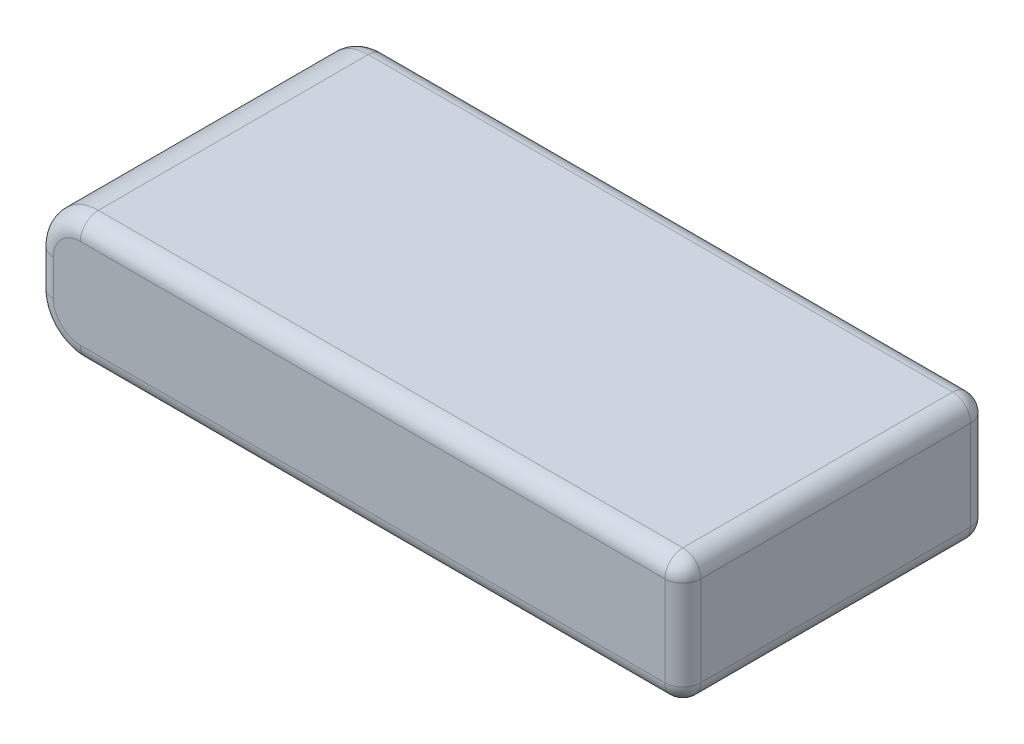
ISO-10303-21;
HEADER;
FILE_DESCRIPTION(('STEP AP214'),'2;1');
FILE_NAME('part.step','',(''),(''),'','','');
FILE_SCHEMA(('AUTOMOTIVE_DESIGN { 1 0 10303 214 1 1 1 1 }'));
ENDSEC;
DATA;
#1=APPLICATION_CONTEXT('core data for automotive mechanical design processes');
#2=APPLICATION_PROTOCOL_DEFINITION('international standard','automotive_design',2000,#1);
#3=PRODUCT_CONTEXT('',#1,'mechanical');
#4=PRODUCT('Part','Part','',(#3));
#5=PRODUCT_RELATED_PRODUCT_CATEGORY('part','',(#4));
#6=PRODUCT_DEFINITION_FORMATION('','',#4);
#7=PRODUCT_DEFINITION_CONTEXT('part definition',#1,'design');
#8=PRODUCT_DEFINITION('design','',#6,#7);
#9=PRODUCT_DEFINITION_SHAPE('','',#8);
#10=(LENGTH_UNIT() NAMED_UNIT(*) SI_UNIT(.MILLI.,.METRE.));
#11=(NAMED_UNIT(*) PLANE_ANGLE_UNIT() SI_UNIT($,.RADIAN.));
#12=(NAMED_UNIT(*) SI_UNIT($,.STERADIAN.) SOLID_ANGLE_UNIT());
#13=UNCERTAINTY_MEASURE_WITH_UNIT(LENGTH_MEASURE(1.E-05),#10,'distance_accuracy_value','');
#14=(GEOMETRIC_REPRESENTATION_CONTEXT(3) GLOBAL_UNCERTAINTY_ASSIGNED_CONTEXT((#13)) GLOBAL_UNIT_ASSIGNED_CONTEXT((#10,
#11,#12)) REPRESENTATION_CONTEXT('',''));
#15=CARTESIAN_POINT('',(0.,0.,0.));
#16=DIRECTION('',(0.,0.,1.));
#17=DIRECTION('',(1.,0.,0.));
#18=AXIS2_PLACEMENT_3D('',#15,#16,#17);
#19=CARTESIAN_POINT('',(36.,14.,17.));
#20=DIRECTION('',(-1.,0.,0.));
#21=DIRECTION('',(0.,0.,1.));
#22=AXIS2_PLACEMENT_3D('',#19,#20,#21);
#23=PLANE('',#22);
#24=DIRECTION('',(0.,0.,-1.));
#25=VECTOR('',#24,1.);
#26=CARTESIAN_POINT('',(36.,12.,17.));
#27=LINE('',#26,#25);
#28=CARTESIAN_POINT('',(36.,12.,-15.));
#29=VERTEX_POINT('',#28);
#30=CARTESIAN_POINT('',(36.,12.,15.));
#31=VERTEX_POINT('',#30);
#32=EDGE_CURVE('E247',#29,#31,#27,.F.);
#33=ORIENTED_EDGE('',*,*,#32,.T.);
#34=DIRECTION('',(0.,-1.,0.));
#35=VECTOR('',#34,1.);
#36=CARTESIAN_POINT('',(36.,14.,15.));
#37=LINE('',#36,#35);
#38=CARTESIAN_POINT('',(36.,2.,15.));
#39=VERTEX_POINT('',#38);
#40=EDGE_CURVE('E250',#31,#39,#37,.T.);
#41=ORIENTED_EDGE('',*,*,#40,.T.);
#42=DIRECTION('',(0.,0.,-1.));
#43=VECTOR('',#42,1.);
#44=CARTESIAN_POINT('',(36.,2.,-17.));
#45=LINE('',#44,#43);
#46=CARTESIAN_POINT('',(36.,2.,-15.));
#47=VERTEX_POINT('',#46);
#48=EDGE_CURVE('E242',#39,#47,#45,.T.);
#49=ORIENTED_EDGE('',*,*,#48,.T.);
#50=DIRECTION('',(0.,-1.,0.));
#51=VECTOR('',#50,1.);
#52=CARTESIAN_POINT('',(36.,14.,-15.));
#53=LINE('',#52,#51);
#54=EDGE_CURVE('E166',#47,#29,#53,.F.);
#55=ORIENTED_EDGE('',*,*,#54,.T.);
#56=EDGE_LOOP('',(#33,#41,#49,#55));
#57=FACE_BOUND('',#56,.T.);
#58=ADVANCED_FACE('F47',(#57),#23,.F.);
#59=CARTESIAN_POINT('',(-36.,14.,-17.));
#60=DIRECTION('',(0.,0.,1.));
#61=DIRECTION('',(1.,0.,0.));
#62=AXIS2_PLACEMENT_3D('',#59,#60,#61);
#63=PLANE('',#62);
#64=CARTESIAN_POINT('',(-31.,9.,-17.));
#65=DIRECTION('',(0.,0.,1.));
#66=DIRECTION('',(1.,0.,0.));
#67=AXIS2_PLACEMENT_3D('',#64,#65,#66);
#68=CIRCLE('',#67,3.);
#69=CARTESIAN_POINT('',(-34.,9.,-17.));
#70=VERTEX_POINT('',#69);
#71=CARTESIAN_POINT('',(-31.,12.,-17.));
#72=VERTEX_POINT('',#71);
#73=EDGE_CURVE('E199',#70,#72,#68,.F.);
#74=ORIENTED_EDGE('',*,*,#73,.T.);
#75=DIRECTION('',(-1.,0.,0.));
#76=VECTOR('',#75,1.);
#77=CARTESIAN_POINT('',(-36.,12.,-17.));
#78=LINE('',#77,#76);
#79=CARTESIAN_POINT('',(34.,12.,-17.));
#80=VERTEX_POINT('',#79);
#81=EDGE_CURVE('E154',#72,#80,#78,.F.);
#82=ORIENTED_EDGE('',*,*,#81,.T.);
#83=DIRECTION('',(0.,-1.,0.));
#84=VECTOR('',#83,1.);
#85=CARTESIAN_POINT('',(34.,14.,-17.));
#86=LINE('',#85,#84);
#87=CARTESIAN_POINT('',(34.,2.,-17.));
#88=VERTEX_POINT('',#87);
#89=EDGE_CURVE('E146',#80,#88,#86,.T.);
#90=ORIENTED_EDGE('',*,*,#89,.T.);
#91=DIRECTION('',(-1.,0.,0.));
#92=VECTOR('',#91,1.);
#93=CARTESIAN_POINT('',(-31.,2.,-17.));
#94=LINE('',#93,#92);
#95=CARTESIAN_POINT('',(-31.,2.,-17.));
#96=VERTEX_POINT('',#95);
#97=EDGE_CURVE('E151',#88,#96,#94,.T.);
#98=ORIENTED_EDGE('',*,*,#97,.T.);
#99=CARTESIAN_POINT('',(-31.,5.,-17.));
#100=DIRECTION('',(0.,0.,1.));
#101=DIRECTION('',(1.,0.,0.));
#102=AXIS2_PLACEMENT_3D('',#99,#100,#101);
#103=CIRCLE('',#102,3.);
#104=CARTESIAN_POINT('',(-34.,5.,-17.));
#105=VERTEX_POINT('',#104);
#106=EDGE_CURVE('E159',#96,#105,#103,.F.);
#107=ORIENTED_EDGE('',*,*,#106,.T.);
#108=DIRECTION('',(0.,-1.,0.));
#109=VECTOR('',#108,1.);
#110=CARTESIAN_POINT('',(-34.,14.,-17.));
#111=LINE('',#110,#109);
#112=EDGE_CURVE('E196',#105,#70,#111,.F.);
#113=ORIENTED_EDGE('',*,*,#112,.T.);
#114=EDGE_LOOP('',(#74,#82,#90,#98,#107,#113));
#115=FACE_BOUND('',#114,.T.);
#116=ADVANCED_FACE('F149',(#115),#63,.F.);
#117=CARTESIAN_POINT('',(-36.,14.,17.));
#118=DIRECTION('',(1.,0.,0.));
#119=DIRECTION('',(0.,0.,-1.));
#120=AXIS2_PLACEMENT_3D('',#117,#118,#119);
#121=PLANE('',#120);
#122=DIRECTION('',(0.,0.,1.));
#123=VECTOR('',#122,1.);
#124=CARTESIAN_POINT('',(-36.,9.,17.));
#125=LINE('',#124,#123);
#126=CARTESIAN_POINT('',(-36.,9.,15.));
#127=VERTEX_POINT('',#126);
#128=CARTESIAN_POINT('',(-36.,9.,-15.));
#129=VERTEX_POINT('',#128);
#130=EDGE_CURVE('E331',#127,#129,#125,.F.);
#131=ORIENTED_EDGE('',*,*,#130,.T.);
#132=DIRECTION('',(0.,-1.,0.));
#133=VECTOR('',#132,1.);
#134=CARTESIAN_POINT('',(-36.,14.,-15.));
#135=LINE('',#134,#133);
#136=CARTESIAN_POINT('',(-36.,5.,-15.));
#137=VERTEX_POINT('',#136);
#138=EDGE_CURVE('E214',#129,#137,#135,.T.);
#139=ORIENTED_EDGE('',*,*,#138,.T.);
#140=DIRECTION('',(0.,0.,1.));
#141=VECTOR('',#140,1.);
#142=CARTESIAN_POINT('',(-36.,5.,17.));
#143=LINE('',#142,#141);
#144=CARTESIAN_POINT('',(-36.,5.,15.));
#145=VERTEX_POINT('',#144);
#146=EDGE_CURVE('E336',#137,#145,#143,.T.);
#147=ORIENTED_EDGE('',*,*,#146,.T.);
#148=DIRECTION('',(0.,-1.,0.));
#149=VECTOR('',#148,1.);
#150=CARTESIAN_POINT('',(-36.,14.,15.));
#151=LINE('',#150,#149);
#152=EDGE_CURVE('E211',#145,#127,#151,.F.);
#153=ORIENTED_EDGE('',*,*,#152,.T.);
#154=EDGE_LOOP('',(#131,#139,#147,#153));
#155=FACE_BOUND('',#154,.T.);
#156=ADVANCED_FACE('F401',(#155),#121,.F.);
#157=CARTESIAN_POINT('',(-36.,14.,17.));
#158=DIRECTION('',(0.,0.,-1.));
#159=DIRECTION('',(-1.,0.,0.));
#160=AXIS2_PLACEMENT_3D('',#157,#158,#159);
#161=PLANE('',#160);
#162=CARTESIAN_POINT('',(-31.,5.,17.));
#163=DIRECTION('',(0.,0.,-1.));
#164=DIRECTION('',(-1.,0.,0.));
#165=AXIS2_PLACEMENT_3D('',#162,#163,#164);
#166=CIRCLE('',#165,3.);
#167=CARTESIAN_POINT('',(-34.,5.,17.));
#168=VERTEX_POINT('',#167);
#169=CARTESIAN_POINT('',(-31.,2.,17.));
#170=VERTEX_POINT('',#169);
#171=EDGE_CURVE('E235',#168,#170,#166,.F.);
#172=ORIENTED_EDGE('',*,*,#171,.T.);
#173=DIRECTION('',(1.,0.,0.));
#174=VECTOR('',#173,1.);
#175=CARTESIAN_POINT('',(36.,2.,17.));
#176=LINE('',#175,#174);
#177=CARTESIAN_POINT('',(34.,2.,17.));
#178=VERTEX_POINT('',#177);
#179=EDGE_CURVE('E239',#170,#178,#176,.T.);
#180=ORIENTED_EDGE('',*,*,#179,.T.);
#181=DIRECTION('',(0.,-1.,0.));
#182=VECTOR('',#181,1.);
#183=CARTESIAN_POINT('',(34.,14.,17.));
#184=LINE('',#183,#182);
#185=CARTESIAN_POINT('',(34.,12.,17.));
#186=VERTEX_POINT('',#185);
#187=EDGE_CURVE('E226',#178,#186,#184,.F.);
#188=ORIENTED_EDGE('',*,*,#187,.T.);
#189=DIRECTION('',(1.,0.,0.));
#190=VECTOR('',#189,1.);
#191=CARTESIAN_POINT('',(-36.,12.,17.));
#192=LINE('',#191,#190);
#193=CARTESIAN_POINT('',(-31.,12.,17.));
#194=VERTEX_POINT('',#193);
#195=EDGE_CURVE('E223',#186,#194,#192,.F.);
#196=ORIENTED_EDGE('',*,*,#195,.T.);
#197=CARTESIAN_POINT('',(-31.,9.,17.));
#198=DIRECTION('',(0.,0.,-1.));
#199=DIRECTION('',(-1.,0.,0.));
#200=AXIS2_PLACEMENT_3D('',#197,#198,#199);
#201=CIRCLE('',#200,3.);
#202=CARTESIAN_POINT('',(-34.,9.,17.));
#203=VERTEX_POINT('',#202);
#204=EDGE_CURVE('E229',#194,#203,#201,.F.);
#205=ORIENTED_EDGE('',*,*,#204,.T.);
#206=DIRECTION('',(0.,-1.,0.));
#207=VECTOR('',#206,1.);
#208=CARTESIAN_POINT('',(-34.,14.,17.));
#209=LINE('',#208,#207);
#210=EDGE_CURVE('E232',#203,#168,#209,.T.);
#211=ORIENTED_EDGE('',*,*,#210,.T.);
#212=EDGE_LOOP('',(#172,#180,#188,#196,#205,#211));
#213=FACE_BOUND('',#212,.T.);
#214=ADVANCED_FACE('F391',(#213),#161,.F.);
#215=CARTESIAN_POINT('',(0.,14.,0.));
#216=DIRECTION('',(0.,-1.,0.));
#217=DIRECTION('',(0.,0.,-1.));
#218=AXIS2_PLACEMENT_3D('',#215,#216,#217);
#219=PLANE('',#218);
#220=DIRECTION('',(0.,0.,-1.));
#221=VECTOR('',#220,1.);
#222=CARTESIAN_POINT('',(34.,14.,0.));
#223=LINE('',#222,#221);
#224=CARTESIAN_POINT('',(34.,14.,15.));
#225=VERTEX_POINT('',#224);
#226=CARTESIAN_POINT('',(34.,14.,-15.));
#227=VERTEX_POINT('',#226);
#228=EDGE_CURVE('E257',#225,#227,#223,.T.);
#229=ORIENTED_EDGE('',*,*,#228,.T.);
#230=DIRECTION('',(-1.,0.,0.));
#231=VECTOR('',#230,1.);
#232=CARTESIAN_POINT('',(0.,14.,-15.));
#233=LINE('',#232,#231);
#234=CARTESIAN_POINT('',(-31.,14.,-15.));
#235=VERTEX_POINT('',#234);
#236=EDGE_CURVE('E260',#227,#235,#233,.T.);
#237=ORIENTED_EDGE('',*,*,#236,.T.);
#238=DIRECTION('',(0.,0.,1.));
#239=VECTOR('',#238,1.);
#240=CARTESIAN_POINT('',(-31.,14.,0.));
#241=LINE('',#240,#239);
#242=CARTESIAN_POINT('',(-31.,14.,15.));
#243=VERTEX_POINT('',#242);
#244=EDGE_CURVE('E186',#235,#243,#241,.T.);
#245=ORIENTED_EDGE('',*,*,#244,.T.);
#246=DIRECTION('',(1.,0.,0.));
#247=VECTOR('',#246,1.);
#248=CARTESIAN_POINT('',(0.,14.,15.));
#249=LINE('',#248,#247);
#250=EDGE_CURVE('E254',#243,#225,#249,.T.);
#251=ORIENTED_EDGE('',*,*,#250,.T.);
#252=EDGE_LOOP('',(#229,#237,#245,#251));
#253=FACE_BOUND('',#252,.T.);
#254=ADVANCED_FACE('F406',(#253),#219,.F.);
#255=CARTESIAN_POINT('',(0.,0.,0.));
#256=DIRECTION('',(0.,-1.,0.));
#257=DIRECTION('',(0.,0.,-1.));
#258=AXIS2_PLACEMENT_3D('',#255,#256,#257);
#259=PLANE('',#258);
#260=DIRECTION('',(0.,0.,1.));
#261=VECTOR('',#260,1.);
#262=CARTESIAN_POINT('',(-31.,0.,-17.));
#263=LINE('',#262,#261);
#264=CARTESIAN_POINT('',(-31.,0.,15.));
#265=VERTEX_POINT('',#264);
#266=CARTESIAN_POINT('',(-31.,0.,-15.));
#267=VERTEX_POINT('',#266);
#268=EDGE_CURVE('E190',#265,#267,#263,.F.);
#269=ORIENTED_EDGE('',*,*,#268,.T.);
#270=DIRECTION('',(-1.,0.,0.));
#271=VECTOR('',#270,1.);
#272=CARTESIAN_POINT('',(36.,0.,-15.));
#273=LINE('',#272,#271);
#274=CARTESIAN_POINT('',(34.,0.,-15.));
#275=VERTEX_POINT('',#274);
#276=EDGE_CURVE('E11',#267,#275,#273,.F.);
#277=ORIENTED_EDGE('',*,*,#276,.T.);
#278=DIRECTION('',(0.,0.,-1.));
#279=VECTOR('',#278,1.);
#280=CARTESIAN_POINT('',(34.,0.,17.));
#281=LINE('',#280,#279);
#282=CARTESIAN_POINT('',(34.,0.,15.));
#283=VERTEX_POINT('',#282);
#284=EDGE_CURVE('E57',#275,#283,#281,.F.);
#285=ORIENTED_EDGE('',*,*,#284,.T.);
#286=DIRECTION('',(1.,0.,0.));
#287=VECTOR('',#286,1.);
#288=CARTESIAN_POINT('',(-31.,0.,15.));
#289=LINE('',#288,#287);
#290=EDGE_CURVE('E263',#283,#265,#289,.F.);
#291=ORIENTED_EDGE('',*,*,#290,.T.);
#292=EDGE_LOOP('',(#269,#277,#285,#291));
#293=FACE_BOUND('',#292,.T.);
#294=ADVANCED_FACE('F345',(#293),#259,.T.);
#295=CARTESIAN_POINT('',(-31.,5.,17.));
#296=DIRECTION('',(0.,0.,-1.));
#297=DIRECTION('',(-1.,0.,0.));
#298=AXIS2_PLACEMENT_3D('',#295,#296,#297);
#299=CYLINDRICAL_SURFACE('',#298,5.);
#300=ORIENTED_EDGE('',*,*,#146,.F.);
#301=CARTESIAN_POINT('',(-31.,5.,-15.));
#302=DIRECTION('',(0.,0.,1.));
#303=DIRECTION('',(1.,0.,0.));
#304=AXIS2_PLACEMENT_3D('',#301,#302,#303);
#305=CIRCLE('',#304,5.);
#306=EDGE_CURVE('E220',#137,#267,#305,.T.);
#307=ORIENTED_EDGE('',*,*,#306,.T.);
#308=ORIENTED_EDGE('',*,*,#268,.F.);
#309=CARTESIAN_POINT('',(-31.,5.,15.));
#310=DIRECTION('',(0.,0.,-1.));
#311=DIRECTION('',(-1.,0.,0.));
#312=AXIS2_PLACEMENT_3D('',#309,#310,#311);
#313=CIRCLE('',#312,5.);
#314=EDGE_CURVE('E217',#265,#145,#313,.T.);
#315=ORIENTED_EDGE('',*,*,#314,.T.);
#316=EDGE_LOOP('',(#300,#307,#308,#315));
#317=FACE_BOUND('',#316,.T.);
#318=ADVANCED_FACE('F400',(#317),#299,.T.);
#319=CARTESIAN_POINT('',(-31.,9.,0.));
#320=DIRECTION('',(0.,0.,1.));
#321=DIRECTION('',(1.,0.,0.));
#322=AXIS2_PLACEMENT_3D('',#319,#320,#321);
#323=CYLINDRICAL_SURFACE('',#322,5.);
#324=ORIENTED_EDGE('',*,*,#244,.F.);
#325=CARTESIAN_POINT('',(-31.,9.,-15.));
#326=DIRECTION('',(0.,0.,1.));
#327=DIRECTION('',(1.,0.,0.));
#328=AXIS2_PLACEMENT_3D('',#325,#326,#327);
#329=CIRCLE('',#328,5.);
#330=EDGE_CURVE('E207',#235,#129,#329,.T.);
#331=ORIENTED_EDGE('',*,*,#330,.T.);
#332=ORIENTED_EDGE('',*,*,#130,.F.);
#333=CARTESIAN_POINT('',(-31.,9.,15.));
#334=DIRECTION('',(0.,0.,-1.));
#335=DIRECTION('',(-1.,0.,0.));
#336=AXIS2_PLACEMENT_3D('',#333,#334,#335);
#337=CIRCLE('',#336,5.);
#338=EDGE_CURVE('E204',#127,#243,#337,.T.);
#339=ORIENTED_EDGE('',*,*,#338,.T.);
#340=EDGE_LOOP('',(#324,#331,#332,#339));
#341=FACE_BOUND('',#340,.T.);
#342=ADVANCED_FACE('F404',(#341),#323,.T.);
#343=CARTESIAN_POINT('',(-31.,5.,15.));
#344=DIRECTION('',(0.,0.,-1.));
#345=DIRECTION('',(-1.,0.,0.));
#346=AXIS2_PLACEMENT_3D('',#343,#344,#345);
#347=TOROIDAL_SURFACE('',#346,3.,2.);
#348=CARTESIAN_POINT('',(-34.,5.,15.));
#349=DIRECTION('',(0.,1.,0.));
#350=DIRECTION('',(0.,0.,1.));
#351=AXIS2_PLACEMENT_3D('',#348,#349,#350);
#352=CIRCLE('',#351,2.);
#353=EDGE_CURVE('E322',#145,#168,#352,.T.);
#354=ORIENTED_EDGE('',*,*,#353,.F.);
#355=ORIENTED_EDGE('',*,*,#314,.F.);
#356=CARTESIAN_POINT('',(-31.,2.,15.));
#357=DIRECTION('',(1.,0.,0.));
#358=DIRECTION('',(0.,0.,-1.));
#359=AXIS2_PLACEMENT_3D('',#356,#357,#358);
#360=CIRCLE('',#359,2.);
#361=EDGE_CURVE('E51',#170,#265,#360,.T.);
#362=ORIENTED_EDGE('',*,*,#361,.F.);
#363=ORIENTED_EDGE('',*,*,#171,.F.);
#364=EDGE_LOOP('',(#354,#355,#362,#363));
#365=FACE_BOUND('',#364,.T.);
#366=ADVANCED_FACE('F49',(#365),#347,.T.);
#367=CARTESIAN_POINT('',(-36.,2.,15.));
#368=DIRECTION('',(-1.,0.,0.));
#369=DIRECTION('',(0.,0.,1.));
#370=AXIS2_PLACEMENT_3D('',#367,#368,#369);
#371=CYLINDRICAL_SURFACE('',#370,2.);
#372=ORIENTED_EDGE('',*,*,#361,.T.);
#373=ORIENTED_EDGE('',*,*,#290,.F.);
#374=CARTESIAN_POINT('',(34.,2.,15.));
#375=DIRECTION('',(1.,0.,0.));
#376=DIRECTION('',(0.,0.,-1.));
#377=AXIS2_PLACEMENT_3D('',#374,#375,#376);
#378=CIRCLE('',#377,2.);
#379=EDGE_CURVE('E319',#178,#283,#378,.T.);
#380=ORIENTED_EDGE('',*,*,#379,.F.);
#381=ORIENTED_EDGE('',*,*,#179,.F.);
#382=EDGE_LOOP('',(#372,#373,#380,#381));
#383=FACE_BOUND('',#382,.T.);
#384=ADVANCED_FACE('F462',(#383),#371,.T.);
#385=CARTESIAN_POINT('',(-34.,14.,15.));
#386=DIRECTION('',(0.,-1.,0.));
#387=DIRECTION('',(0.,0.,-1.));
#388=AXIS2_PLACEMENT_3D('',#385,#386,#387);
#389=CYLINDRICAL_SURFACE('',#388,2.);
#390=ORIENTED_EDGE('',*,*,#353,.T.);
#391=ORIENTED_EDGE('',*,*,#210,.F.);
#392=CARTESIAN_POINT('',(-34.,9.,15.));
#393=DIRECTION('',(0.,1.,0.));
#394=DIRECTION('',(0.,0.,1.));
#395=AXIS2_PLACEMENT_3D('',#392,#393,#394);
#396=CIRCLE('',#395,2.);
#397=EDGE_CURVE('E315',#127,#203,#396,.T.);
#398=ORIENTED_EDGE('',*,*,#397,.F.);
#399=ORIENTED_EDGE('',*,*,#152,.F.);
#400=EDGE_LOOP('',(#390,#391,#398,#399));
#401=FACE_BOUND('',#400,.T.);
#402=ADVANCED_FACE('F396',(#401),#389,.T.);
#403=CARTESIAN_POINT('',(34.,2.,15.));
#404=DIRECTION('',(0.,-1.,0.));
#405=DIRECTION('',(0.,0.,-1.));
#406=AXIS2_PLACEMENT_3D('',#403,#404,#405);
#407=SPHERICAL_SURFACE('',#406,2.);
#408=CARTESIAN_POINT('',(34.,2.,15.));
#409=DIRECTION('',(0.,-1.,0.));
#410=DIRECTION('',(0.,0.,-1.));
#411=AXIS2_PLACEMENT_3D('',#408,#409,#410);
#412=CIRCLE('',#411,2.);
#413=EDGE_CURVE('E307',#178,#39,#412,.F.);
#414=ORIENTED_EDGE('',*,*,#413,.F.);
#415=ORIENTED_EDGE('',*,*,#379,.T.);
#416=CARTESIAN_POINT('',(34.,2.,15.));
#417=DIRECTION('',(0.,0.,1.));
#418=DIRECTION('',(1.,0.,0.));
#419=AXIS2_PLACEMENT_3D('',#416,#417,#418);
#420=CIRCLE('',#419,2.);
#421=EDGE_CURVE('E311',#39,#283,#420,.F.);
#422=ORIENTED_EDGE('',*,*,#421,.F.);
#423=EDGE_LOOP('',(#414,#415,#422));
#424=FACE_BOUND('',#423,.T.);
#425=ADVANCED_FACE('F457',(#424),#407,.T.);
#426=CARTESIAN_POINT('',(-31.,9.,15.));
#427=DIRECTION('',(0.,0.,-1.));
#428=DIRECTION('',(-1.,0.,0.));
#429=AXIS2_PLACEMENT_3D('',#426,#427,#428);
#430=TOROIDAL_SURFACE('',#429,3.,2.);
#431=ORIENTED_EDGE('',*,*,#397,.T.);
#432=ORIENTED_EDGE('',*,*,#204,.F.);
#433=CARTESIAN_POINT('',(-31.,12.,15.));
#434=DIRECTION('',(1.,0.,0.));
#435=DIRECTION('',(0.,0.,-1.));
#436=AXIS2_PLACEMENT_3D('',#433,#434,#435);
#437=CIRCLE('',#436,2.);
#438=EDGE_CURVE('E303',#243,#194,#437,.T.);
#439=ORIENTED_EDGE('',*,*,#438,.F.);
#440=ORIENTED_EDGE('',*,*,#338,.F.);
#441=EDGE_LOOP('',(#431,#432,#439,#440));
#442=FACE_BOUND('',#441,.T.);
#443=ADVANCED_FACE('F393',(#442),#430,.T.);
#444=CARTESIAN_POINT('',(34.,2.,17.));
#445=DIRECTION('',(0.,0.,1.));
#446=DIRECTION('',(1.,0.,0.));
#447=AXIS2_PLACEMENT_3D('',#444,#445,#446);
#448=CYLINDRICAL_SURFACE('',#447,2.);
#449=ORIENTED_EDGE('',*,*,#421,.T.);
#450=ORIENTED_EDGE('',*,*,#284,.F.);
#451=CARTESIAN_POINT('',(34.,2.,-15.));
#452=DIRECTION('',(0.,0.,-1.));
#453=DIRECTION('',(-1.,0.,0.));
#454=AXIS2_PLACEMENT_3D('',#451,#452,#453);
#455=CIRCLE('',#454,2.);
#456=EDGE_CURVE('E176',#47,#275,#455,.T.);
#457=ORIENTED_EDGE('',*,*,#456,.F.);
#458=ORIENTED_EDGE('',*,*,#48,.F.);
#459=EDGE_LOOP('',(#449,#450,#457,#458));
#460=FACE_BOUND('',#459,.T.);
#461=ADVANCED_FACE('F451',(#460),#448,.T.);
#462=CARTESIAN_POINT('',(34.,14.,15.));
#463=DIRECTION('',(0.,-1.,0.));
#464=DIRECTION('',(0.,0.,-1.));
#465=AXIS2_PLACEMENT_3D('',#462,#463,#464);
#466=CYLINDRICAL_SURFACE('',#465,2.);
#467=ORIENTED_EDGE('',*,*,#413,.T.);
#468=ORIENTED_EDGE('',*,*,#40,.F.);
#469=CARTESIAN_POINT('',(34.,12.,15.));
#470=DIRECTION('',(0.,1.,0.));
#471=DIRECTION('',(0.,0.,1.));
#472=AXIS2_PLACEMENT_3D('',#469,#470,#471);
#473=CIRCLE('',#472,2.);
#474=EDGE_CURVE('E297',#186,#31,#473,.T.);
#475=ORIENTED_EDGE('',*,*,#474,.F.);
#476=ORIENTED_EDGE('',*,*,#187,.F.);
#477=EDGE_LOOP('',(#467,#468,#475,#476));
#478=FACE_BOUND('',#477,.T.);
#479=ADVANCED_FACE('F378',(#478),#466,.T.);
#480=CARTESIAN_POINT('',(0.,12.,15.));
#481=DIRECTION('',(1.,0.,0.));
#482=DIRECTION('',(0.,0.,-1.));
#483=AXIS2_PLACEMENT_3D('',#480,#481,#482);
#484=CYLINDRICAL_SURFACE('',#483,2.);
#485=ORIENTED_EDGE('',*,*,#438,.T.);
#486=ORIENTED_EDGE('',*,*,#195,.F.);
#487=CARTESIAN_POINT('',(34.,12.,15.));
#488=DIRECTION('',(1.,0.,0.));
#489=DIRECTION('',(0.,0.,-1.));
#490=AXIS2_PLACEMENT_3D('',#487,#488,#489);
#491=CIRCLE('',#490,2.);
#492=EDGE_CURVE('E179',#225,#186,#491,.T.);
#493=ORIENTED_EDGE('',*,*,#492,.F.);
#494=ORIENTED_EDGE('',*,*,#250,.F.);
#495=EDGE_LOOP('',(#485,#486,#493,#494));
#496=FACE_BOUND('',#495,.T.);
#497=ADVANCED_FACE('F387',(#496),#484,.T.);
#498=CARTESIAN_POINT('',(34.,2.,-15.));
#499=DIRECTION('',(0.,-1.,0.));
#500=DIRECTION('',(0.,0.,-1.));
#501=AXIS2_PLACEMENT_3D('',#498,#499,#500);
#502=SPHERICAL_SURFACE('',#501,2.);
#503=CARTESIAN_POINT('',(34.,2.,-15.));
#504=DIRECTION('',(0.,-1.,0.));
#505=DIRECTION('',(0.,0.,-1.));
#506=AXIS2_PLACEMENT_3D('',#503,#504,#505);
#507=CIRCLE('',#506,2.);
#508=EDGE_CURVE('E163',#47,#88,#507,.F.);
#509=ORIENTED_EDGE('',*,*,#508,.F.);
#510=ORIENTED_EDGE('',*,*,#456,.T.);
#511=CARTESIAN_POINT('',(34.,2.,-15.));
#512=DIRECTION('',(1.,0.,0.));
#513=DIRECTION('',(0.,0.,-1.));
#514=AXIS2_PLACEMENT_3D('',#511,#512,#513);
#515=CIRCLE('',#514,2.);
#516=EDGE_CURVE('E170',#88,#275,#515,.F.);
#517=ORIENTED_EDGE('',*,*,#516,.F.);
#518=EDGE_LOOP('',(#509,#510,#517));
#519=FACE_BOUND('',#518,.T.);
#520=ADVANCED_FACE('F174',(#519),#502,.T.);
#521=CARTESIAN_POINT('',(34.,12.,15.));
#522=DIRECTION('',(0.,0.,1.));
#523=DIRECTION('',(1.,0.,0.));
#524=AXIS2_PLACEMENT_3D('',#521,#522,#523);
#525=SPHERICAL_SURFACE('',#524,2.);
#526=ORIENTED_EDGE('',*,*,#492,.T.);
#527=ORIENTED_EDGE('',*,*,#474,.T.);
#528=CARTESIAN_POINT('',(34.,12.,15.));
#529=DIRECTION('',(0.,0.,1.));
#530=DIRECTION('',(1.,0.,0.));
#531=AXIS2_PLACEMENT_3D('',#528,#529,#530);
#532=CIRCLE('',#531,2.);
#533=EDGE_CURVE('E171',#225,#31,#532,.F.);
#534=ORIENTED_EDGE('',*,*,#533,.F.);
#535=EDGE_LOOP('',(#526,#527,#534));
#536=FACE_BOUND('',#535,.T.);
#537=ADVANCED_FACE('F382',(#536),#525,.T.);
#538=CARTESIAN_POINT('',(-36.,2.,-15.));
#539=DIRECTION('',(1.,0.,0.));
#540=DIRECTION('',(0.,0.,-1.));
#541=AXIS2_PLACEMENT_3D('',#538,#539,#540);
#542=CYLINDRICAL_SURFACE('',#541,2.);
#543=ORIENTED_EDGE('',*,*,#516,.T.);
#544=ORIENTED_EDGE('',*,*,#276,.F.);
#545=CARTESIAN_POINT('',(-31.,2.,-15.));
#546=DIRECTION('',(-1.,0.,0.));
#547=DIRECTION('',(0.,0.,1.));
#548=AXIS2_PLACEMENT_3D('',#545,#546,#547);
#549=CIRCLE('',#548,2.);
#550=EDGE_CURVE('E183',#96,#267,#549,.T.);
#551=ORIENTED_EDGE('',*,*,#550,.F.);
#552=ORIENTED_EDGE('',*,*,#97,.F.);
#553=EDGE_LOOP('',(#543,#544,#551,#552));
#554=FACE_BOUND('',#553,.T.);
#555=ADVANCED_FACE('F181',(#554),#542,.T.);
#556=CARTESIAN_POINT('',(34.,14.,-15.));
#557=DIRECTION('',(0.,-1.,0.));
#558=DIRECTION('',(0.,0.,-1.));
#559=AXIS2_PLACEMENT_3D('',#556,#557,#558);
#560=CYLINDRICAL_SURFACE('',#559,2.);
#561=ORIENTED_EDGE('',*,*,#508,.T.);
#562=ORIENTED_EDGE('',*,*,#89,.F.);
#563=CARTESIAN_POINT('',(34.,12.,-15.));
#564=DIRECTION('',(0.,1.,0.));
#565=DIRECTION('',(0.,0.,1.));
#566=AXIS2_PLACEMENT_3D('',#563,#564,#565);
#567=CIRCLE('',#566,2.);
#568=EDGE_CURVE('E286',#29,#80,#567,.T.);
#569=ORIENTED_EDGE('',*,*,#568,.F.);
#570=ORIENTED_EDGE('',*,*,#54,.F.);
#571=EDGE_LOOP('',(#561,#562,#569,#570));
#572=FACE_BOUND('',#571,.T.);
#573=ADVANCED_FACE('F165',(#572),#560,.T.);
#574=CARTESIAN_POINT('',(34.,12.,0.));
#575=DIRECTION('',(0.,0.,-1.));
#576=DIRECTION('',(-1.,0.,0.));
#577=AXIS2_PLACEMENT_3D('',#574,#575,#576);
#578=CYLINDRICAL_SURFACE('',#577,2.);
#579=ORIENTED_EDGE('',*,*,#533,.T.);
#580=ORIENTED_EDGE('',*,*,#32,.F.);
#581=CARTESIAN_POINT('',(34.,12.,-15.));
#582=DIRECTION('',(0.,0.,-1.));
#583=DIRECTION('',(-1.,0.,0.));
#584=AXIS2_PLACEMENT_3D('',#581,#582,#583);
#585=CIRCLE('',#584,2.);
#586=EDGE_CURVE('E282',#227,#29,#585,.T.);
#587=ORIENTED_EDGE('',*,*,#586,.F.);
#588=ORIENTED_EDGE('',*,*,#228,.F.);
#589=EDGE_LOOP('',(#579,#580,#587,#588));
#590=FACE_BOUND('',#589,.T.);
#591=ADVANCED_FACE('F372',(#590),#578,.T.);
#592=CARTESIAN_POINT('',(-31.,5.,-15.));
#593=DIRECTION('',(0.,0.,1.));
#594=DIRECTION('',(1.,0.,0.));
#595=AXIS2_PLACEMENT_3D('',#592,#593,#594);
#596=TOROIDAL_SURFACE('',#595,3.,2.);
#597=ORIENTED_EDGE('',*,*,#550,.T.);
#598=ORIENTED_EDGE('',*,*,#306,.F.);
#599=CARTESIAN_POINT('',(-34.,5.,-15.));
#600=DIRECTION('',(0.,1.,0.));
#601=DIRECTION('',(0.,0.,1.));
#602=AXIS2_PLACEMENT_3D('',#599,#600,#601);
#603=CIRCLE('',#602,2.);
#604=EDGE_CURVE('E278',#105,#137,#603,.T.);
#605=ORIENTED_EDGE('',*,*,#604,.F.);
#606=ORIENTED_EDGE('',*,*,#106,.F.);
#607=EDGE_LOOP('',(#597,#598,#605,#606));
#608=FACE_BOUND('',#607,.T.);
#609=ADVANCED_FACE('F350',(#608),#596,.T.);
#610=CARTESIAN_POINT('',(34.,12.,-15.));
#611=DIRECTION('',(1.,0.,0.));
#612=DIRECTION('',(0.,0.,-1.));
#613=AXIS2_PLACEMENT_3D('',#610,#611,#612);
#614=SPHERICAL_SURFACE('',#613,2.);
#615=ORIENTED_EDGE('',*,*,#586,.T.);
#616=ORIENTED_EDGE('',*,*,#568,.T.);
#617=CARTESIAN_POINT('',(34.,12.,-15.));
#618=DIRECTION('',(1.,0.,0.));
#619=DIRECTION('',(0.,0.,-1.));
#620=AXIS2_PLACEMENT_3D('',#617,#618,#619);
#621=CIRCLE('',#620,2.);
#622=EDGE_CURVE('E274',#227,#80,#621,.F.);
#623=ORIENTED_EDGE('',*,*,#622,.F.);
#624=EDGE_LOOP('',(#615,#616,#623));
#625=FACE_BOUND('',#624,.T.);
#626=ADVANCED_FACE('F367',(#625),#614,.T.);
#627=CARTESIAN_POINT('',(-34.,14.,-15.));
#628=DIRECTION('',(0.,-1.,0.));
#629=DIRECTION('',(0.,0.,-1.));
#630=AXIS2_PLACEMENT_3D('',#627,#628,#629);
#631=CYLINDRICAL_SURFACE('',#630,2.);
#632=ORIENTED_EDGE('',*,*,#604,.T.);
#633=ORIENTED_EDGE('',*,*,#138,.F.);
#634=CARTESIAN_POINT('',(-34.,9.,-15.));
#635=DIRECTION('',(0.,1.,0.));
#636=DIRECTION('',(0.,0.,1.));
#637=AXIS2_PLACEMENT_3D('',#634,#635,#636);
#638=CIRCLE('',#637,2.);
#639=EDGE_CURVE('E271',#70,#129,#638,.T.);
#640=ORIENTED_EDGE('',*,*,#639,.F.);
#641=ORIENTED_EDGE('',*,*,#112,.F.);
#642=EDGE_LOOP('',(#632,#633,#640,#641));
#643=FACE_BOUND('',#642,.T.);
#644=ADVANCED_FACE('F357',(#643),#631,.T.);
#645=CARTESIAN_POINT('',(0.,12.,-15.));
#646=DIRECTION('',(-1.,0.,0.));
#647=DIRECTION('',(0.,0.,1.));
#648=AXIS2_PLACEMENT_3D('',#645,#646,#647);
#649=CYLINDRICAL_SURFACE('',#648,2.);
#650=ORIENTED_EDGE('',*,*,#622,.T.);
#651=ORIENTED_EDGE('',*,*,#81,.F.);
#652=CARTESIAN_POINT('',(-31.,12.,-15.));
#653=DIRECTION('',(-1.,0.,0.));
#654=DIRECTION('',(0.,0.,1.));
#655=AXIS2_PLACEMENT_3D('',#652,#653,#654);
#656=CIRCLE('',#655,2.);
#657=EDGE_CURVE('E268',#235,#72,#656,.T.);
#658=ORIENTED_EDGE('',*,*,#657,.F.);
#659=ORIENTED_EDGE('',*,*,#236,.F.);
#660=EDGE_LOOP('',(#650,#651,#658,#659));
#661=FACE_BOUND('',#660,.T.);
#662=ADVANCED_FACE('F364',(#661),#649,.T.);
#663=CARTESIAN_POINT('',(-31.,9.,-15.));
#664=DIRECTION('',(0.,0.,1.));
#665=DIRECTION('',(1.,0.,0.));
#666=AXIS2_PLACEMENT_3D('',#663,#664,#665);
#667=TOROIDAL_SURFACE('',#666,3.,2.);
#668=ORIENTED_EDGE('',*,*,#639,.T.);
#669=ORIENTED_EDGE('',*,*,#330,.F.);
#670=ORIENTED_EDGE('',*,*,#657,.T.);
#671=ORIENTED_EDGE('',*,*,#73,.F.);
#672=EDGE_LOOP('',(#668,#669,#670,#671));
#673=FACE_BOUND('',#672,.T.);
#674=ADVANCED_FACE('F360',(#673),#667,.T.);
#675=CLOSED_SHELL('',(#58,#116,#156,#214,#254,#294,#318,#342,#366,#384,#402,#425,#443,#461,#479,
#497,#520,#537,#555,#573,#591,#609,#626,#644,#662,#674));
#676=MANIFOLD_SOLID_BREP('B2',#675);
#677=ADVANCED_BREP_SHAPE_REPRESENTATION('',(#18,#676),#14);
#678=SHAPE_DEFINITION_REPRESENTATION(#9,#677);
ENDSEC;
END-ISO-10303-21;
